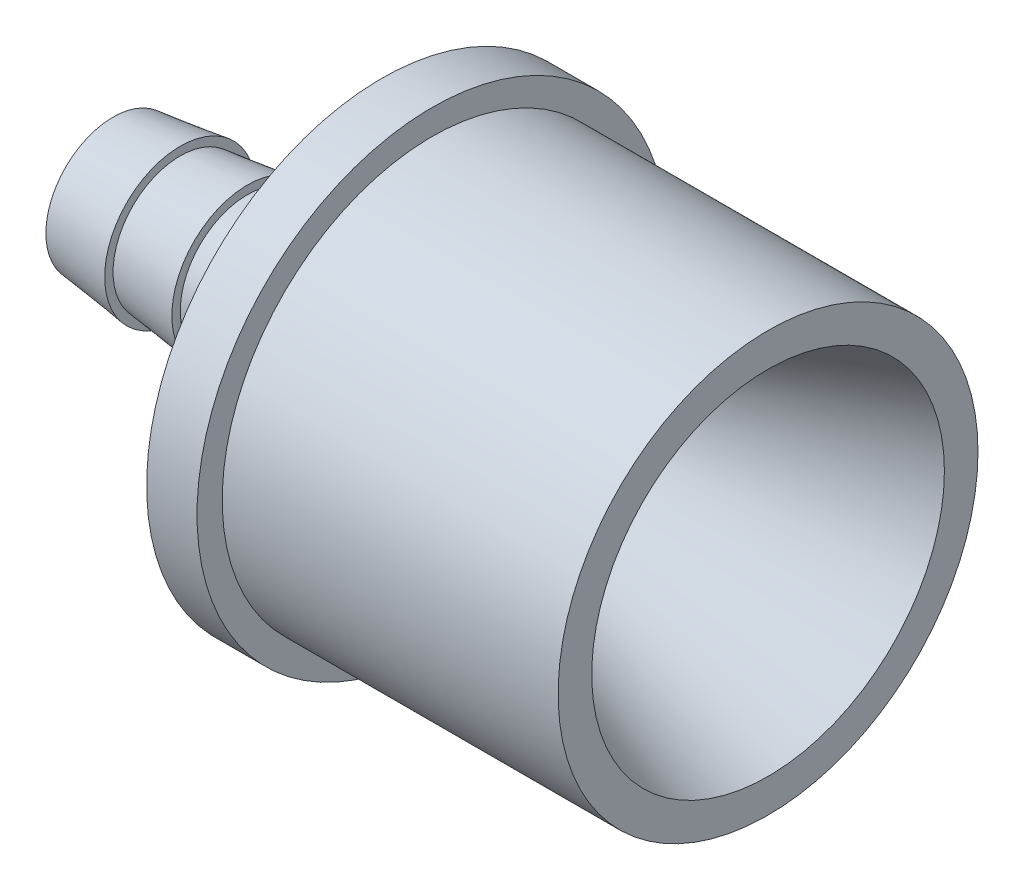
ISO-10303-21;
HEADER;
FILE_DESCRIPTION(('STEP AP214'),'2;1');
FILE_NAME('part.step','',(''),(''),'','','');
FILE_SCHEMA(('AUTOMOTIVE_DESIGN { 1 0 10303 214 1 1 1 1 }'));
ENDSEC;
DATA;
#1=APPLICATION_CONTEXT('core data for automotive mechanical design processes');
#2=APPLICATION_PROTOCOL_DEFINITION('international standard','automotive_design',2000,#1);
#3=PRODUCT_CONTEXT('',#1,'mechanical');
#4=PRODUCT('Part','Part','',(#3));
#5=PRODUCT_RELATED_PRODUCT_CATEGORY('part','',(#4));
#6=PRODUCT_DEFINITION_FORMATION('','',#4);
#7=PRODUCT_DEFINITION_CONTEXT('part definition',#1,'design');
#8=PRODUCT_DEFINITION('design','',#6,#7);
#9=PRODUCT_DEFINITION_SHAPE('','',#8);
#10=(LENGTH_UNIT() NAMED_UNIT(*) SI_UNIT(.MILLI.,.METRE.));
#11=(NAMED_UNIT(*) PLANE_ANGLE_UNIT() SI_UNIT($,.RADIAN.));
#12=(NAMED_UNIT(*) SI_UNIT($,.STERADIAN.) SOLID_ANGLE_UNIT());
#13=UNCERTAINTY_MEASURE_WITH_UNIT(LENGTH_MEASURE(1.E-05),#10,'distance_accuracy_value','');
#14=(GEOMETRIC_REPRESENTATION_CONTEXT(3) GLOBAL_UNCERTAINTY_ASSIGNED_CONTEXT((#13)) GLOBAL_UNIT_ASSIGNED_CONTEXT((#10,
#11,#12)) REPRESENTATION_CONTEXT('',''));
#15=CARTESIAN_POINT('',(0.,0.,0.));
#16=DIRECTION('',(0.,0.,1.));
#17=DIRECTION('',(1.,0.,0.));
#18=AXIS2_PLACEMENT_3D('',#15,#16,#17);
#19=CARTESIAN_POINT('',(48.3217346925492,0.,0.));
#20=DIRECTION('',(1.,0.,0.));
#21=DIRECTION('',(0.,0.,-1.));
#22=AXIS2_PLACEMENT_3D('',#19,#20,#21);
#23=CYLINDRICAL_SURFACE('',#22,14.);
#24=CARTESIAN_POINT('',(-27.3234278073796,0.,0.));
#25=DIRECTION('',(1.,0.,0.));
#26=DIRECTION('',(0.,0.,-1.));
#27=AXIS2_PLACEMENT_3D('',#24,#25,#26);
#28=CIRCLE('',#27,14.);
#29=CARTESIAN_POINT('',(-27.3234278073796,0.,-14.));
#30=VERTEX_POINT('',#29);
#31=EDGE_CURVE('E10',#30,#30,#28,.T.);
#32=ORIENTED_EDGE('',*,*,#31,.F.);
#33=EDGE_LOOP('',(#32));
#34=FACE_BOUND('',#33,.T.);
#35=CARTESIAN_POINT('',(-30.3234278073796,0.,0.));
#36=DIRECTION('',(1.,0.,0.));
#37=DIRECTION('',(0.,0.,-1.));
#38=AXIS2_PLACEMENT_3D('',#35,#36,#37);
#39=CIRCLE('',#38,14.);
#40=CARTESIAN_POINT('',(-30.3234278073796,0.,-14.));
#41=VERTEX_POINT('',#40);
#42=EDGE_CURVE('E100',#41,#41,#39,.T.);
#43=ORIENTED_EDGE('',*,*,#42,.T.);
#44=EDGE_LOOP('',(#43));
#45=FACE_BOUND('',#44,.T.);
#46=ADVANCED_FACE('F37',(#34,#45),#23,.T.);
#47=CARTESIAN_POINT('',(-27.3234278073796,14.,0.));
#48=DIRECTION('',(-1.,0.,0.));
#49=DIRECTION('',(0.,0.,1.));
#50=AXIS2_PLACEMENT_3D('',#47,#48,#49);
#51=PLANE('',#50);
#52=CARTESIAN_POINT('',(-27.3234278073796,0.,0.));
#53=DIRECTION('',(1.,0.,0.));
#54=DIRECTION('',(0.,0.,-1.));
#55=AXIS2_PLACEMENT_3D('',#52,#53,#54);
#56=CIRCLE('',#55,12.5);
#57=CARTESIAN_POINT('',(-27.3234278073796,0.,-12.5));
#58=VERTEX_POINT('',#57);
#59=EDGE_CURVE('E44',#58,#58,#56,.T.);
#60=ORIENTED_EDGE('',*,*,#59,.F.);
#61=EDGE_LOOP('',(#60));
#62=FACE_BOUND('',#61,.T.);
#63=ORIENTED_EDGE('',*,*,#31,.T.);
#64=EDGE_LOOP('',(#63));
#65=FACE_BOUND('',#64,.T.);
#66=ADVANCED_FACE('F180',(#62,#65),#51,.F.);
#67=CARTESIAN_POINT('',(48.3217346925492,0.,0.));
#68=DIRECTION('',(1.,0.,0.));
#69=DIRECTION('',(0.,0.,-1.));
#70=AXIS2_PLACEMENT_3D('',#67,#68,#69);
#71=CYLINDRICAL_SURFACE('',#70,12.5);
#72=CARTESIAN_POINT('',(-7.32342780737956,0.,0.));
#73=DIRECTION('',(1.,0.,0.));
#74=DIRECTION('',(0.,0.,-1.));
#75=AXIS2_PLACEMENT_3D('',#72,#73,#74);
#76=CIRCLE('',#75,12.5);
#77=CARTESIAN_POINT('',(-7.32342780737956,0.,-12.5));
#78=VERTEX_POINT('',#77);
#79=EDGE_CURVE('E49',#78,#78,#76,.T.);
#80=ORIENTED_EDGE('',*,*,#79,.F.);
#81=EDGE_LOOP('',(#80));
#82=FACE_BOUND('',#81,.T.);
#83=ORIENTED_EDGE('',*,*,#59,.T.);
#84=EDGE_LOOP('',(#83));
#85=FACE_BOUND('',#84,.T.);
#86=ADVANCED_FACE('F175',(#82,#85),#71,.T.);
#87=CARTESIAN_POINT('',(-7.32342780737958,12.5,0.));
#88=DIRECTION('',(-1.,0.,0.));
#89=DIRECTION('',(0.,0.,1.));
#90=AXIS2_PLACEMENT_3D('',#87,#88,#89);
#91=PLANE('',#90);
#92=CARTESIAN_POINT('',(-7.3234278073796,0.,0.));
#93=DIRECTION('',(1.,0.,0.));
#94=DIRECTION('',(0.,0.,-1.));
#95=AXIS2_PLACEMENT_3D('',#92,#93,#94);
#96=CIRCLE('',#95,10.5);
#97=CARTESIAN_POINT('',(-7.3234278073796,0.,-10.5));
#98=VERTEX_POINT('',#97);
#99=EDGE_CURVE('E54',#98,#98,#96,.T.);
#100=ORIENTED_EDGE('',*,*,#99,.F.);
#101=EDGE_LOOP('',(#100));
#102=FACE_BOUND('',#101,.T.);
#103=ORIENTED_EDGE('',*,*,#79,.T.);
#104=EDGE_LOOP('',(#103));
#105=FACE_BOUND('',#104,.T.);
#106=ADVANCED_FACE('F169',(#102,#105),#91,.F.);
#107=CARTESIAN_POINT('',(-7.3234278073796,0.,0.));
#108=DIRECTION('',(1.,0.,0.));
#109=DIRECTION('',(0.,0.,-1.));
#110=AXIS2_PLACEMENT_3D('',#107,#108,#109);
#111=CONICAL_SURFACE('',#110,10.5,0.351836649480055);
#112=CARTESIAN_POINT('',(-29.1151859991513,0.,0.));
#113=DIRECTION('',(1.,0.,0.));
#114=DIRECTION('',(0.,0.,-1.));
#115=AXIS2_PLACEMENT_3D('',#112,#113,#114);
#116=CIRCLE('',#115,2.5);
#117=CARTESIAN_POINT('',(-29.1151859991513,0.,-2.5));
#118=VERTEX_POINT('',#117);
#119=EDGE_CURVE('E60',#118,#118,#116,.T.);
#120=CARTESIAN_POINT('',(-29.1151859991513,0.,-2.5));
#121=CARTESIAN_POINT('',(-28.888188517987,0.,-2.58333333333333));
#122=CARTESIAN_POINT('',(-28.6611910368227,0.,-2.66666666666667));
#123=CARTESIAN_POINT('',(-28.2071960744941,0.,-2.83333333333333));
#124=CARTESIAN_POINT('',(-27.9801985933298,0.,-2.91666666666667));
#125=CARTESIAN_POINT('',(-27.5262036310013,0.,-3.08333333333333));
#126=CARTESIAN_POINT('',(-27.299206149837,0.,-3.16666666666666));
#127=CARTESIAN_POINT('',(-26.8452111875084,0.,-3.33333333333333));
#128=CARTESIAN_POINT('',(-26.6182137063441,0.,-3.41666666666666));
#129=CARTESIAN_POINT('',(-26.1642187440155,0.,-3.58333333333333));
#130=CARTESIAN_POINT('',(-25.9372212628512,0.,-3.66666666666666));
#131=CARTESIAN_POINT('',(-25.4832263005227,0.,-3.83333333333333));
#132=CARTESIAN_POINT('',(-25.2562288193584,0.,-3.91666666666666));
#133=CARTESIAN_POINT('',(-24.8022338570298,0.,-4.08333333333333));
#134=CARTESIAN_POINT('',(-24.5752363758655,0.,-4.16666666666667));
#135=CARTESIAN_POINT('',(-24.1212414135369,0.,-4.33333333333333));
#136=CARTESIAN_POINT('',(-23.8942439323726,0.,-4.41666666666666));
#137=CARTESIAN_POINT('',(-23.4402489700441,0.,-4.58333333333333));
#138=CARTESIAN_POINT('',(-23.2132514888798,0.,-4.66666666666666));
#139=CARTESIAN_POINT('',(-22.7592565265512,0.,-4.83333333333333));
#140=CARTESIAN_POINT('',(-22.5322590453869,0.,-4.91666666666666));
#141=CARTESIAN_POINT('',(-22.0782640830583,0.,-5.08333333333333));
#142=CARTESIAN_POINT('',(-21.8512666018941,0.,-5.16666666666666));
#143=CARTESIAN_POINT('',(-21.3972716395655,0.,-5.33333333333333));
#144=CARTESIAN_POINT('',(-21.1702741584012,0.,-5.41666666666666));
#145=CARTESIAN_POINT('',(-20.7162791960726,0.,-5.58333333333333));
#146=CARTESIAN_POINT('',(-20.4892817149083,0.,-5.66666666666666));
#147=CARTESIAN_POINT('',(-20.0352867525797,0.,-5.83333333333333));
#148=CARTESIAN_POINT('',(-19.8082892714155,0.,-5.91666666666666));
#149=CARTESIAN_POINT('',(-19.3542943090869,0.,-6.08333333333333));
#150=CARTESIAN_POINT('',(-19.1272968279226,0.,-6.16666666666666));
#151=CARTESIAN_POINT('',(-18.673301865594,0.,-6.33333333333333));
#152=CARTESIAN_POINT('',(-18.4463043844297,0.,-6.41666666666666));
#153=CARTESIAN_POINT('',(-17.9923094221012,0.,-6.58333333333333));
#154=CARTESIAN_POINT('',(-17.7653119409369,0.,-6.66666666666666));
#155=CARTESIAN_POINT('',(-17.3113169786083,0.,-6.83333333333333));
#156=CARTESIAN_POINT('',(-17.084319497444,0.,-6.91666666666666));
#157=CARTESIAN_POINT('',(-16.6303245351154,0.,-7.08333333333333));
#158=CARTESIAN_POINT('',(-16.4033270539511,0.,-7.16666666666666));
#159=CARTESIAN_POINT('',(-15.9493320916226,0.,-7.33333333333333));
#160=CARTESIAN_POINT('',(-15.7223346104583,0.,-7.41666666666666));
#161=CARTESIAN_POINT('',(-15.2683396481297,0.,-7.58333333333333));
#162=CARTESIAN_POINT('',(-15.0413421669654,0.,-7.66666666666666));
#163=CARTESIAN_POINT('',(-14.5873472046368,0.,-7.83333333333333));
#164=CARTESIAN_POINT('',(-14.3603497234725,0.,-7.91666666666666));
#165=CARTESIAN_POINT('',(-13.906354761144,0.,-8.08333333333333));
#166=CARTESIAN_POINT('',(-13.6793572799797,0.,-8.16666666666666));
#167=CARTESIAN_POINT('',(-13.2253623176511,0.,-8.33333333333333));
#168=CARTESIAN_POINT('',(-12.9983648364868,0.,-8.41666666666666));
#169=CARTESIAN_POINT('',(-12.5443698741582,0.,-8.58333333333333));
#170=CARTESIAN_POINT('',(-12.3173723929939,0.,-8.66666666666666));
#171=CARTESIAN_POINT('',(-11.8633774306654,0.,-8.83333333333333));
#172=CARTESIAN_POINT('',(-11.6363799495011,0.,-8.91666666666666));
#173=CARTESIAN_POINT('',(-11.1823849871725,0.,-9.08333333333333));
#174=CARTESIAN_POINT('',(-10.9553875060082,0.,-9.16666666666666));
#175=CARTESIAN_POINT('',(-10.5013925436796,0.,-9.33333333333333));
#176=CARTESIAN_POINT('',(-10.2743950625153,0.,-9.41666666666666));
#177=CARTESIAN_POINT('',(-9.82040010018677,0.,-9.58333333333333));
#178=CARTESIAN_POINT('',(-9.59340261902248,0.,-9.66666666666666));
#179=CARTESIAN_POINT('',(-9.13940765669391,0.,-9.83333333333333));
#180=CARTESIAN_POINT('',(-8.91241017552962,0.,-9.91666666666666));
#181=CARTESIAN_POINT('',(-8.45841521320104,0.,-10.0833333333333));
#182=CARTESIAN_POINT('',(-8.23141773203676,0.,-10.1666666666667));
#183=CARTESIAN_POINT('',(-7.77742276970818,0.,-10.3333333333333));
#184=CARTESIAN_POINT('',(-7.55042528854389,0.,-10.4166666666667));
#185=CARTESIAN_POINT('',(-7.3234278073796,0.,-10.5));
#186=B_SPLINE_CURVE_WITH_KNOTS('',3,(#120,#121,#122,#123,#124,#125,#126,#127,#128,#129,#130,
#131,#132,#133,#134,#135,#136,#137,#138,#139,#140,#141,#142,#143,#144,#145,#146,#147,#148,#149,
#150,#151,#152,#153,#154,#155,#156,#157,#158,#159,#160,#161,#162,#163,#164,#165,#166,#167,#168,
#169,#170,#171,#172,#173,#174,#175,#176,#177,#178,#179,#180,#181,#182,#183,#184,#185),
.UNSPECIFIED.,.F.,.F.,(4,2,2,2,2,2,2,2,2,2,2,2,2,2,2,2,2,2,2,2,2,2,2,2,2,2,2,2,2,2,2,2,4),(0.,
0.725431394478061,1.45086278895612,2.17629418343418,2.90172557791224,3.6271569723903,
4.35258836686836,5.07801976134642,5.80345115582448,6.52888255030254,7.2543139447806,
7.97974533925866,8.70517673373672,9.43060812821478,10.1560395226928,10.8814709171709,
11.606902311649,12.332333706127,13.0577651006051,13.7831964950831,14.5086278895612,
15.2340592840393,15.9594906785173,16.6849220729954,17.4103534674734,18.1357848619515,
18.8612162564296,19.5866476509076,20.3120790453857,21.0375104398637,21.7629418343418,
22.4883732288199,23.2138046232979),.UNSPECIFIED.);
#187=EDGE_CURVE('BSEAM163',#118,#98,#186,.T.);
#188=ORIENTED_EDGE('',*,*,#119,.F.);
#189=ORIENTED_EDGE('',*,*,#99,.T.);
#190=ORIENTED_EDGE('',*,*,#187,.T.);
#191=ORIENTED_EDGE('',*,*,#187,.F.);
#192=EDGE_LOOP('',(#188,#190,#189,#191));
#193=FACE_BOUND('',#192,.T.);
#194=ADVANCED_FACE('F163',(#193),#111,.F.);
#195=CARTESIAN_POINT('',(48.3217346925492,0.,0.));
#196=DIRECTION('',(1.,0.,0.));
#197=DIRECTION('',(0.,0.,-1.));
#198=AXIS2_PLACEMENT_3D('',#195,#196,#197);
#199=CYLINDRICAL_SURFACE('',#198,2.5);
#200=CARTESIAN_POINT('',(-46.3234278073796,0.,0.));
#201=DIRECTION('',(1.,0.,0.));
#202=DIRECTION('',(0.,0.,-1.));
#203=AXIS2_PLACEMENT_3D('',#200,#201,#202);
#204=CIRCLE('',#203,2.5);
#205=CARTESIAN_POINT('',(-46.3234278073796,0.,-2.5));
#206=VERTEX_POINT('',#205);
#207=EDGE_CURVE('E64',#206,#206,#204,.T.);
#208=ORIENTED_EDGE('',*,*,#207,.F.);
#209=EDGE_LOOP('',(#208));
#210=FACE_BOUND('',#209,.T.);
#211=ORIENTED_EDGE('',*,*,#119,.T.);
#212=EDGE_LOOP('',(#211));
#213=FACE_BOUND('',#212,.T.);
#214=ADVANCED_FACE('F157',(#210,#213),#199,.F.);
#215=CARTESIAN_POINT('',(-46.3234278073796,2.5,0.));
#216=DIRECTION('',(1.,0.,0.));
#217=DIRECTION('',(0.,0.,-1.));
#218=AXIS2_PLACEMENT_3D('',#215,#216,#217);
#219=PLANE('',#218);
#220=CARTESIAN_POINT('',(-46.3234278073796,0.,0.));
#221=DIRECTION('',(1.,0.,0.));
#222=DIRECTION('',(0.,0.,-1.));
#223=AXIS2_PLACEMENT_3D('',#220,#221,#222);
#224=CIRCLE('',#223,4.);
#225=CARTESIAN_POINT('',(-46.3234278073796,0.,-4.));
#226=VERTEX_POINT('',#225);
#227=EDGE_CURVE('E68',#226,#226,#224,.T.);
#228=ORIENTED_EDGE('',*,*,#227,.F.);
#229=EDGE_LOOP('',(#228));
#230=FACE_BOUND('',#229,.T.);
#231=ORIENTED_EDGE('',*,*,#207,.T.);
#232=EDGE_LOOP('',(#231));
#233=FACE_BOUND('',#232,.T.);
#234=ADVANCED_FACE('F151',(#230,#233),#219,.F.);
#235=CARTESIAN_POINT('',(-46.3234278073796,0.,0.));
#236=DIRECTION('',(1.,0.,0.));
#237=DIRECTION('',(0.,0.,-1.));
#238=AXIS2_PLACEMENT_3D('',#235,#236,#237);
#239=CONICAL_SURFACE('',#238,4.,0.124354994546762);
#240=CARTESIAN_POINT('',(-42.3234278073796,0.,0.));
#241=DIRECTION('',(1.,0.,0.));
#242=DIRECTION('',(0.,0.,-1.));
#243=AXIS2_PLACEMENT_3D('',#240,#241,#242);
#244=CIRCLE('',#243,4.5);
#245=CARTESIAN_POINT('',(-42.3234278073796,0.,-4.5));
#246=VERTEX_POINT('',#245);
#247=EDGE_CURVE('E72',#246,#246,#244,.T.);
#248=ORIENTED_EDGE('',*,*,#247,.F.);
#249=EDGE_LOOP('',(#248));
#250=FACE_BOUND('',#249,.T.);
#251=ORIENTED_EDGE('',*,*,#227,.T.);
#252=EDGE_LOOP('',(#251));
#253=FACE_BOUND('',#252,.T.);
#254=ADVANCED_FACE('F145',(#250,#253),#239,.T.);
#255=CARTESIAN_POINT('',(-42.3234278073796,4.5,0.));
#256=DIRECTION('',(-1.,0.,0.));
#257=DIRECTION('',(0.,0.,1.));
#258=AXIS2_PLACEMENT_3D('',#255,#256,#257);
#259=PLANE('',#258);
#260=CARTESIAN_POINT('',(-42.3234278073796,0.,0.));
#261=DIRECTION('',(1.,0.,0.));
#262=DIRECTION('',(0.,0.,-1.));
#263=AXIS2_PLACEMENT_3D('',#260,#261,#262);
#264=CIRCLE('',#263,4.);
#265=CARTESIAN_POINT('',(-42.3234278073796,0.,-4.));
#266=VERTEX_POINT('',#265);
#267=EDGE_CURVE('E76',#266,#266,#264,.T.);
#268=ORIENTED_EDGE('',*,*,#267,.F.);
#269=EDGE_LOOP('',(#268));
#270=FACE_BOUND('',#269,.T.);
#271=ORIENTED_EDGE('',*,*,#247,.T.);
#272=EDGE_LOOP('',(#271));
#273=FACE_BOUND('',#272,.T.);
#274=ADVANCED_FACE('F139',(#270,#273),#259,.F.);
#275=CARTESIAN_POINT('',(-42.3234278073796,0.,0.));
#276=DIRECTION('',(1.,0.,0.));
#277=DIRECTION('',(0.,0.,-1.));
#278=AXIS2_PLACEMENT_3D('',#275,#276,#277);
#279=CONICAL_SURFACE('',#278,4.,0.124354994546762);
#280=CARTESIAN_POINT('',(-38.3234278073796,0.,0.));
#281=DIRECTION('',(1.,0.,0.));
#282=DIRECTION('',(0.,0.,-1.));
#283=AXIS2_PLACEMENT_3D('',#280,#281,#282);
#284=CIRCLE('',#283,4.5);
#285=CARTESIAN_POINT('',(-38.3234278073796,0.,-4.5));
#286=VERTEX_POINT('',#285);
#287=EDGE_CURVE('E80',#286,#286,#284,.T.);
#288=ORIENTED_EDGE('',*,*,#287,.F.);
#289=EDGE_LOOP('',(#288));
#290=FACE_BOUND('',#289,.T.);
#291=ORIENTED_EDGE('',*,*,#267,.T.);
#292=EDGE_LOOP('',(#291));
#293=FACE_BOUND('',#292,.T.);
#294=ADVANCED_FACE('F133',(#290,#293),#279,.T.);
#295=CARTESIAN_POINT('',(-38.3234278073796,4.5,0.));
#296=DIRECTION('',(-1.,0.,0.));
#297=DIRECTION('',(0.,0.,1.));
#298=AXIS2_PLACEMENT_3D('',#295,#296,#297);
#299=PLANE('',#298);
#300=CARTESIAN_POINT('',(-38.3234278073796,0.,0.));
#301=DIRECTION('',(1.,0.,0.));
#302=DIRECTION('',(0.,0.,-1.));
#303=AXIS2_PLACEMENT_3D('',#300,#301,#302);
#304=CIRCLE('',#303,4.);
#305=CARTESIAN_POINT('',(-38.3234278073796,0.,-4.));
#306=VERTEX_POINT('',#305);
#307=EDGE_CURVE('E84',#306,#306,#304,.T.);
#308=ORIENTED_EDGE('',*,*,#307,.F.);
#309=EDGE_LOOP('',(#308));
#310=FACE_BOUND('',#309,.T.);
#311=ORIENTED_EDGE('',*,*,#287,.T.);
#312=EDGE_LOOP('',(#311));
#313=FACE_BOUND('',#312,.T.);
#314=ADVANCED_FACE('F127',(#310,#313),#299,.F.);
#315=CARTESIAN_POINT('',(-38.3234278073796,0.,0.));
#316=DIRECTION('',(1.,0.,0.));
#317=DIRECTION('',(0.,0.,-1.));
#318=AXIS2_PLACEMENT_3D('',#315,#316,#317);
#319=CONICAL_SURFACE('',#318,4.,0.124354994546762);
#320=CARTESIAN_POINT('',(-34.3234278073796,0.,0.));
#321=DIRECTION('',(1.,0.,0.));
#322=DIRECTION('',(0.,0.,-1.));
#323=AXIS2_PLACEMENT_3D('',#320,#321,#322);
#324=CIRCLE('',#323,4.5);
#325=CARTESIAN_POINT('',(-34.3234278073796,0.,-4.5));
#326=VERTEX_POINT('',#325);
#327=EDGE_CURVE('E88',#326,#326,#324,.T.);
#328=ORIENTED_EDGE('',*,*,#327,.F.);
#329=EDGE_LOOP('',(#328));
#330=FACE_BOUND('',#329,.T.);
#331=ORIENTED_EDGE('',*,*,#307,.T.);
#332=EDGE_LOOP('',(#331));
#333=FACE_BOUND('',#332,.T.);
#334=ADVANCED_FACE('F121',(#330,#333),#319,.T.);
#335=CARTESIAN_POINT('',(-34.3234278073796,4.5,0.));
#336=DIRECTION('',(-1.,0.,0.));
#337=DIRECTION('',(0.,0.,1.));
#338=AXIS2_PLACEMENT_3D('',#335,#336,#337);
#339=PLANE('',#338);
#340=CARTESIAN_POINT('',(-34.3234278073796,0.,0.));
#341=DIRECTION('',(1.,0.,0.));
#342=DIRECTION('',(0.,0.,-1.));
#343=AXIS2_PLACEMENT_3D('',#340,#341,#342);
#344=CIRCLE('',#343,4.);
#345=CARTESIAN_POINT('',(-34.3234278073796,0.,-4.));
#346=VERTEX_POINT('',#345);
#347=EDGE_CURVE('E92',#346,#346,#344,.T.);
#348=ORIENTED_EDGE('',*,*,#347,.F.);
#349=EDGE_LOOP('',(#348));
#350=FACE_BOUND('',#349,.T.);
#351=ORIENTED_EDGE('',*,*,#327,.T.);
#352=EDGE_LOOP('',(#351));
#353=FACE_BOUND('',#352,.T.);
#354=ADVANCED_FACE('F115',(#350,#353),#339,.F.);
#355=CARTESIAN_POINT('',(-34.3234278073796,0.,0.));
#356=DIRECTION('',(1.,0.,0.));
#357=DIRECTION('',(0.,0.,-1.));
#358=AXIS2_PLACEMENT_3D('',#355,#356,#357);
#359=CONICAL_SURFACE('',#358,4.,0.124354994546761);
#360=CARTESIAN_POINT('',(-30.3234278073796,0.,0.));
#361=DIRECTION('',(1.,0.,0.));
#362=DIRECTION('',(0.,0.,-1.));
#363=AXIS2_PLACEMENT_3D('',#360,#361,#362);
#364=CIRCLE('',#363,4.5);
#365=CARTESIAN_POINT('',(-30.3234278073796,0.,-4.5));
#366=VERTEX_POINT('',#365);
#367=EDGE_CURVE('E96',#366,#366,#364,.T.);
#368=ORIENTED_EDGE('',*,*,#367,.F.);
#369=EDGE_LOOP('',(#368));
#370=FACE_BOUND('',#369,.T.);
#371=ORIENTED_EDGE('',*,*,#347,.T.);
#372=EDGE_LOOP('',(#371));
#373=FACE_BOUND('',#372,.T.);
#374=ADVANCED_FACE('F109',(#370,#373),#359,.T.);
#375=CARTESIAN_POINT('',(-30.3234278073796,4.5,0.));
#376=DIRECTION('',(1.,0.,0.));
#377=DIRECTION('',(0.,0.,-1.));
#378=AXIS2_PLACEMENT_3D('',#375,#376,#377);
#379=PLANE('',#378);
#380=ORIENTED_EDGE('',*,*,#42,.F.);
#381=EDGE_LOOP('',(#380));
#382=FACE_BOUND('',#381,.T.);
#383=ORIENTED_EDGE('',*,*,#367,.T.);
#384=EDGE_LOOP('',(#383));
#385=FACE_BOUND('',#384,.T.);
#386=ADVANCED_FACE('F106',(#382,#385),#379,.F.);
#387=CLOSED_SHELL('',(#46,#66,#86,#106,#194,#214,#234,#254,#274,#294,#314,#334,#354,#374,#386));
#388=MANIFOLD_SOLID_BREP('B2',#387);
#389=ADVANCED_BREP_SHAPE_REPRESENTATION('',(#18,#388),#14);
#390=SHAPE_DEFINITION_REPRESENTATION(#9,#389);
ENDSEC;
END-ISO-10303-21;
